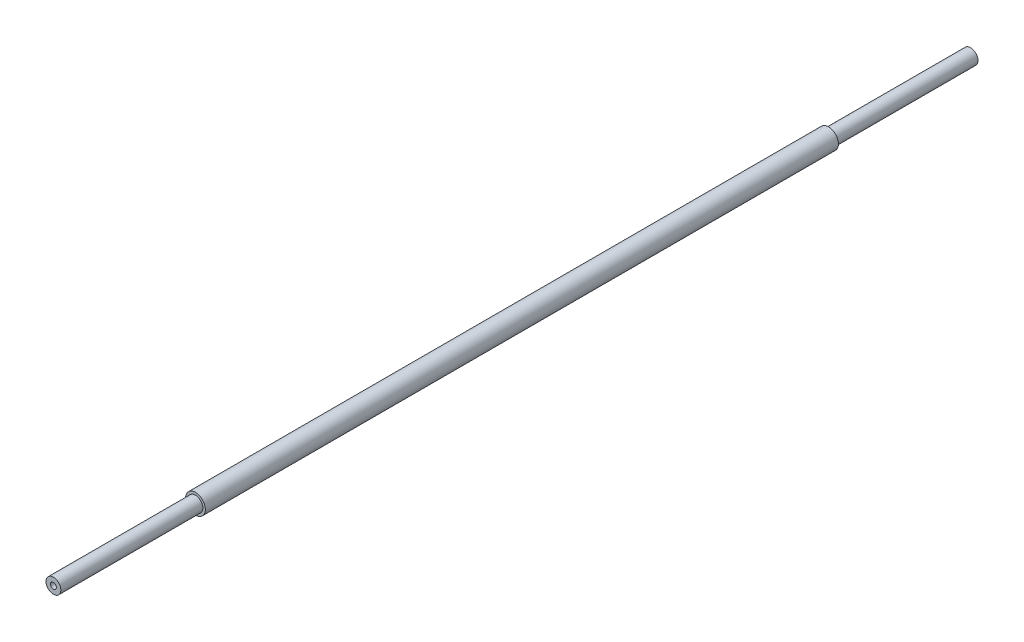
ISO-10303-21;
HEADER;
FILE_DESCRIPTION(('STEP AP214'),'2;1');
FILE_NAME('part.step','',(''),(''),'','','');
FILE_SCHEMA(('AUTOMOTIVE_DESIGN { 1 0 10303 214 1 1 1 1 }'));
ENDSEC;
DATA;
#1=APPLICATION_CONTEXT('core data for automotive mechanical design processes');
#2=APPLICATION_PROTOCOL_DEFINITION('international standard','automotive_design',2000,#1);
#3=PRODUCT_CONTEXT('',#1,'mechanical');
#4=PRODUCT('Part','Part','',(#3));
#5=PRODUCT_RELATED_PRODUCT_CATEGORY('part','',(#4));
#6=PRODUCT_DEFINITION_FORMATION('','',#4);
#7=PRODUCT_DEFINITION_CONTEXT('part definition',#1,'design');
#8=PRODUCT_DEFINITION('design','',#6,#7);
#9=PRODUCT_DEFINITION_SHAPE('','',#8);
#10=(LENGTH_UNIT() NAMED_UNIT(*) SI_UNIT(.MILLI.,.METRE.));
#11=(NAMED_UNIT(*) PLANE_ANGLE_UNIT() SI_UNIT($,.RADIAN.));
#12=(NAMED_UNIT(*) SI_UNIT($,.STERADIAN.) SOLID_ANGLE_UNIT());
#13=UNCERTAINTY_MEASURE_WITH_UNIT(LENGTH_MEASURE(1.E-05),#10,'distance_accuracy_value','');
#14=(GEOMETRIC_REPRESENTATION_CONTEXT(3) GLOBAL_UNCERTAINTY_ASSIGNED_CONTEXT((#13)) GLOBAL_UNIT_ASSIGNED_CONTEXT((#10,
#11,#12)) REPRESENTATION_CONTEXT('',''));
#15=CARTESIAN_POINT('',(0.,0.,0.));
#16=DIRECTION('',(0.,0.,1.));
#17=DIRECTION('',(1.,0.,0.));
#18=AXIS2_PLACEMENT_3D('',#15,#16,#17);
#19=CARTESIAN_POINT('',(0.,0.,588.772));
#20=DIRECTION('',(0.,0.,-1.));
#21=DIRECTION('',(-1.,0.,0.));
#22=AXIS2_PLACEMENT_3D('',#19,#20,#21);
#23=CYLINDRICAL_SURFACE('',#22,4.7625);
#24=CARTESIAN_POINT('',(0.,0.,497.586));
#25=DIRECTION('',(0.,0.,1.));
#26=DIRECTION('',(1.,0.,0.));
#27=AXIS2_PLACEMENT_3D('',#24,#25,#26);
#28=CIRCLE('',#27,4.7625);
#29=CARTESIAN_POINT('',(4.7625,0.,497.586));
#30=VERTEX_POINT('',#29);
#31=EDGE_CURVE('E52',#30,#30,#28,.T.);
#32=ORIENTED_EDGE('',*,*,#31,.T.);
#33=EDGE_LOOP('',(#32));
#34=FACE_BOUND('',#33,.T.);
#35=CARTESIAN_POINT('',(0.,0.,588.772));
#36=DIRECTION('',(0.,0.,1.));
#37=DIRECTION('',(1.,0.,0.));
#38=AXIS2_PLACEMENT_3D('',#35,#36,#37);
#39=CIRCLE('',#38,4.7625);
#40=CARTESIAN_POINT('',(4.7625,0.,588.772));
#41=VERTEX_POINT('',#40);
#42=EDGE_CURVE('E38',#41,#41,#39,.T.);
#43=ORIENTED_EDGE('',*,*,#42,.F.);
#44=EDGE_LOOP('',(#43));
#45=FACE_BOUND('',#44,.T.);
#46=ADVANCED_FACE('F32',(#34,#45),#23,.T.);
#47=CARTESIAN_POINT('',(0.,0.,588.772));
#48=DIRECTION('',(0.,0.,1.));
#49=DIRECTION('',(1.,0.,0.));
#50=AXIS2_PLACEMENT_3D('',#47,#48,#49);
#51=PLANE('',#50);
#52=CARTESIAN_POINT('',(0.,0.,588.772));
#53=DIRECTION('',(0.,0.,1.));
#54=DIRECTION('',(1.,0.,0.));
#55=AXIS2_PLACEMENT_3D('',#52,#53,#54);
#56=CIRCLE('',#55,1.89864999999992);
#57=CARTESIAN_POINT('',(1.89864999999992,0.,588.772));
#58=VERTEX_POINT('',#57);
#59=EDGE_CURVE('E60',#58,#58,#56,.T.);
#60=ORIENTED_EDGE('',*,*,#59,.F.);
#61=EDGE_LOOP('',(#60));
#62=FACE_BOUND('',#61,.T.);
#63=ORIENTED_EDGE('',*,*,#42,.T.);
#64=EDGE_LOOP('',(#63));
#65=FACE_BOUND('',#64,.T.);
#66=ADVANCED_FACE('F66',(#62,#65),#51,.T.);
#67=CARTESIAN_POINT('',(0.,0.,497.586));
#68=DIRECTION('',(0.,0.,1.));
#69=DIRECTION('',(1.,0.,0.));
#70=AXIS2_PLACEMENT_3D('',#67,#68,#69);
#71=PLANE('',#70);
#72=CARTESIAN_POINT('',(0.,0.,497.586));
#73=DIRECTION('',(0.,0.,1.));
#74=DIRECTION('',(1.,0.,0.));
#75=AXIS2_PLACEMENT_3D('',#72,#73,#74);
#76=CIRCLE('',#75,6.35);
#77=CARTESIAN_POINT('',(6.35,0.,497.586));
#78=VERTEX_POINT('',#77);
#79=EDGE_CURVE('E47',#78,#78,#76,.T.);
#80=ORIENTED_EDGE('',*,*,#79,.T.);
#81=EDGE_LOOP('',(#80));
#82=FACE_BOUND('',#81,.T.);
#83=ORIENTED_EDGE('',*,*,#31,.F.);
#84=EDGE_LOOP('',(#83));
#85=FACE_BOUND('',#84,.T.);
#86=ADVANCED_FACE('F68',(#82,#85),#71,.T.);
#87=CARTESIAN_POINT('',(0.,0.,91.186));
#88=DIRECTION('',(0.,0.,1.));
#89=DIRECTION('',(1.,0.,0.));
#90=AXIS2_PLACEMENT_3D('',#87,#88,#89);
#91=PLANE('',#90);
#92=CARTESIAN_POINT('',(0.,0.,91.186));
#93=DIRECTION('',(0.,0.,1.));
#94=DIRECTION('',(1.,0.,0.));
#95=AXIS2_PLACEMENT_3D('',#92,#93,#94);
#96=CIRCLE('',#95,6.35);
#97=CARTESIAN_POINT('',(6.35,0.,91.186));
#98=VERTEX_POINT('',#97);
#99=EDGE_CURVE('E49',#98,#98,#96,.T.);
#100=ORIENTED_EDGE('',*,*,#99,.F.);
#101=EDGE_LOOP('',(#100));
#102=FACE_BOUND('',#101,.T.);
#103=CARTESIAN_POINT('',(0.,0.,91.186));
#104=DIRECTION('',(0.,0.,1.));
#105=DIRECTION('',(1.,0.,0.));
#106=AXIS2_PLACEMENT_3D('',#103,#104,#105);
#107=CIRCLE('',#106,4.7625);
#108=CARTESIAN_POINT('',(4.7625,0.,91.186));
#109=VERTEX_POINT('',#108);
#110=EDGE_CURVE('E10',#109,#109,#107,.T.);
#111=ORIENTED_EDGE('',*,*,#110,.T.);
#112=EDGE_LOOP('',(#111));
#113=FACE_BOUND('',#112,.T.);
#114=ADVANCED_FACE('F74',(#102,#113),#91,.F.);
#115=CARTESIAN_POINT('',(0.,0.,497.586));
#116=DIRECTION('',(0.,0.,-1.));
#117=DIRECTION('',(-1.,0.,0.));
#118=AXIS2_PLACEMENT_3D('',#115,#116,#117);
#119=CYLINDRICAL_SURFACE('',#118,6.35);
#120=ORIENTED_EDGE('',*,*,#79,.F.);
#121=EDGE_LOOP('',(#120));
#122=FACE_BOUND('',#121,.T.);
#123=ORIENTED_EDGE('',*,*,#99,.T.);
#124=EDGE_LOOP('',(#123));
#125=FACE_BOUND('',#124,.T.);
#126=ADVANCED_FACE('F80',(#122,#125),#119,.T.);
#127=CARTESIAN_POINT('',(0.,0.,0.));
#128=DIRECTION('',(0.,0.,1.));
#129=DIRECTION('',(1.,0.,0.));
#130=AXIS2_PLACEMENT_3D('',#127,#128,#129);
#131=PLANE('',#130);
#132=CARTESIAN_POINT('',(0.,0.,0.));
#133=DIRECTION('',(0.,0.,1.));
#134=DIRECTION('',(1.,0.,0.));
#135=AXIS2_PLACEMENT_3D('',#132,#133,#134);
#136=CIRCLE('',#135,1.89864999999985);
#137=CARTESIAN_POINT('',(1.89864999999985,0.,0.));
#138=VERTEX_POINT('',#137);
#139=EDGE_CURVE('E57',#138,#138,#136,.T.);
#140=ORIENTED_EDGE('',*,*,#139,.T.);
#141=EDGE_LOOP('',(#140));
#142=FACE_BOUND('',#141,.T.);
#143=CARTESIAN_POINT('',(0.,0.,0.));
#144=DIRECTION('',(0.,0.,1.));
#145=DIRECTION('',(1.,0.,0.));
#146=AXIS2_PLACEMENT_3D('',#143,#144,#145);
#147=CIRCLE('',#146,4.7625);
#148=CARTESIAN_POINT('',(4.7625,0.,0.));
#149=VERTEX_POINT('',#148);
#150=EDGE_CURVE('E42',#149,#149,#147,.T.);
#151=ORIENTED_EDGE('',*,*,#150,.F.);
#152=EDGE_LOOP('',(#151));
#153=FACE_BOUND('',#152,.T.);
#154=ADVANCED_FACE('F82',(#142,#153),#131,.F.);
#155=ORIENTED_EDGE('',*,*,#150,.T.);
#156=EDGE_LOOP('',(#155));
#157=FACE_BOUND('',#156,.T.);
#158=ORIENTED_EDGE('',*,*,#110,.F.);
#159=EDGE_LOOP('',(#158));
#160=FACE_BOUND('',#159,.T.);
#161=ADVANCED_FACE('F78',(#157,#160),#23,.T.);
#162=CARTESIAN_POINT('',(0.,0.,588.772));
#163=DIRECTION('',(0.,0.,1.));
#164=DIRECTION('',(1.,0.,0.));
#165=AXIS2_PLACEMENT_3D('',#162,#163,#164);
#166=CYLINDRICAL_SURFACE('',#165,1.89864999999989);
#167=ORIENTED_EDGE('',*,*,#139,.F.);
#168=EDGE_LOOP('',(#167));
#169=FACE_BOUND('',#168,.T.);
#170=ORIENTED_EDGE('',*,*,#59,.T.);
#171=EDGE_LOOP('',(#170));
#172=FACE_BOUND('',#171,.T.);
#173=ADVANCED_FACE('F64',(#169,#172),#166,.F.);
#174=CLOSED_SHELL('',(#46,#66,#86,#114,#126,#154,#161,#173));
#175=MANIFOLD_SOLID_BREP('B2',#174);
#176=ADVANCED_BREP_SHAPE_REPRESENTATION('',(#18,#175),#14);
#177=SHAPE_DEFINITION_REPRESENTATION(#9,#176);
ENDSEC;
END-ISO-10303-21;
